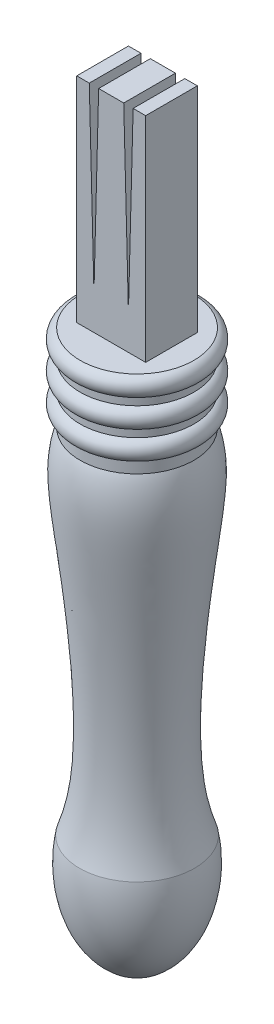
ISO-10303-21;
HEADER;
FILE_DESCRIPTION(('STEP AP214'),'2;1');
FILE_NAME('part.step','',(''),(''),'','','');
FILE_SCHEMA(('AUTOMOTIVE_DESIGN { 1 0 10303 214 1 1 1 1 }'));
ENDSEC;
DATA;
#1=APPLICATION_CONTEXT('core data for automotive mechanical design processes');
#2=APPLICATION_PROTOCOL_DEFINITION('international standard','automotive_design',2000,#1);
#3=PRODUCT_CONTEXT('',#1,'mechanical');
#4=PRODUCT('Part','Part','',(#3));
#5=PRODUCT_RELATED_PRODUCT_CATEGORY('part','',(#4));
#6=PRODUCT_DEFINITION_FORMATION('','',#4);
#7=PRODUCT_DEFINITION_CONTEXT('part definition',#1,'design');
#8=PRODUCT_DEFINITION('design','',#6,#7);
#9=PRODUCT_DEFINITION_SHAPE('','',#8);
#10=(LENGTH_UNIT() NAMED_UNIT(*) SI_UNIT(.MILLI.,.METRE.));
#11=(NAMED_UNIT(*) PLANE_ANGLE_UNIT() SI_UNIT($,.RADIAN.));
#12=(NAMED_UNIT(*) SI_UNIT($,.STERADIAN.) SOLID_ANGLE_UNIT());
#13=UNCERTAINTY_MEASURE_WITH_UNIT(LENGTH_MEASURE(1.E-05),#10,'distance_accuracy_value','');
#14=(GEOMETRIC_REPRESENTATION_CONTEXT(3) GLOBAL_UNCERTAINTY_ASSIGNED_CONTEXT((#13)) GLOBAL_UNIT_ASSIGNED_CONTEXT((#10,
#11,#12)) REPRESENTATION_CONTEXT('',''));
#15=CARTESIAN_POINT('',(0.,0.,0.));
#16=DIRECTION('',(0.,0.,1.));
#17=DIRECTION('',(1.,0.,0.));
#18=AXIS2_PLACEMENT_3D('',#15,#16,#17);
#19=CARTESIAN_POINT('',(0.,279.4,0.));
#20=DIRECTION('',(0.,1.,0.));
#21=DIRECTION('',(0.,0.,1.));
#22=AXIS2_PLACEMENT_3D('',#19,#20,#21);
#23=PLANE('',#22);
#24=DIRECTION('',(0.,0.,1.));
#25=VECTOR('',#24,1.);
#26=CARTESIAN_POINT('',(-8.07931826042913,279.4,0.));
#27=LINE('',#26,#25);
#28=CARTESIAN_POINT('',(-8.07931826042913,279.4,-9.525));
#29=VERTEX_POINT('',#28);
#30=CARTESIAN_POINT('',(-8.07931826042913,279.4,9.52500000000001));
#31=VERTEX_POINT('',#30);
#32=EDGE_CURVE('E12',#29,#31,#27,.T.);
#33=ORIENTED_EDGE('',*,*,#32,.F.);
#34=DIRECTION('',(-1.,0.,0.));
#35=VECTOR('',#34,1.);
#36=CARTESIAN_POINT('',(-12.7,279.4,-9.525));
#37=LINE('',#36,#35);
#38=CARTESIAN_POINT('',(-12.7,279.4,-9.525));
#39=VERTEX_POINT('',#38);
#40=EDGE_CURVE('E125',#29,#39,#37,.T.);
#41=ORIENTED_EDGE('',*,*,#40,.T.);
#42=DIRECTION('',(0.,0.,1.));
#43=VECTOR('',#42,1.);
#44=CARTESIAN_POINT('',(-12.7,279.4,9.525));
#45=LINE('',#44,#43);
#46=CARTESIAN_POINT('',(-12.7,279.4,9.525));
#47=VERTEX_POINT('',#46);
#48=EDGE_CURVE('E144',#39,#47,#45,.T.);
#49=ORIENTED_EDGE('',*,*,#48,.T.);
#50=DIRECTION('',(1.,0.,0.));
#51=VECTOR('',#50,1.);
#52=CARTESIAN_POINT('',(-12.7,279.4,9.525));
#53=LINE('',#52,#51);
#54=EDGE_CURVE('E128',#47,#31,#53,.T.);
#55=ORIENTED_EDGE('',*,*,#54,.T.);
#56=EDGE_LOOP('',(#33,#41,#49,#55));
#57=FACE_BOUND('',#56,.T.);
#58=ADVANCED_FACE('F34',(#57),#23,.T.);
#59=DIRECTION('',(0.,0.,-1.));
#60=VECTOR('',#59,1.);
#61=CARTESIAN_POINT('',(8.07931826042913,279.4,0.));
#62=LINE('',#61,#60);
#63=CARTESIAN_POINT('',(8.07931826042913,279.4,9.52500000000001));
#64=VERTEX_POINT('',#63);
#65=CARTESIAN_POINT('',(8.07931826042913,279.4,-9.525));
#66=VERTEX_POINT('',#65);
#67=EDGE_CURVE('E164',#64,#66,#62,.T.);
#68=ORIENTED_EDGE('',*,*,#67,.F.);
#69=CARTESIAN_POINT('',(12.7,279.4,9.525));
#70=VERTEX_POINT('',#69);
#71=EDGE_CURVE('E148',#64,#70,#53,.T.);
#72=ORIENTED_EDGE('',*,*,#71,.T.);
#73=DIRECTION('',(0.,0.,-1.));
#74=VECTOR('',#73,1.);
#75=CARTESIAN_POINT('',(12.7,279.4,9.525));
#76=LINE('',#75,#74);
#77=CARTESIAN_POINT('',(12.7,279.4,-9.525));
#78=VERTEX_POINT('',#77);
#79=EDGE_CURVE('E135',#70,#78,#76,.T.);
#80=ORIENTED_EDGE('',*,*,#79,.T.);
#81=EDGE_CURVE('E137',#78,#66,#37,.T.);
#82=ORIENTED_EDGE('',*,*,#81,.T.);
#83=EDGE_LOOP('',(#68,#72,#80,#82));
#84=FACE_BOUND('',#83,.T.);
#85=ADVANCED_FACE('F228',(#84),#23,.T.);
#86=CARTESIAN_POINT('',(0.,200.66,0.));
#87=DIRECTION('',(0.,1.,0.));
#88=DIRECTION('',(0.,0.,1.));
#89=AXIS2_PLACEMENT_3D('',#86,#87,#88);
#90=PLANE('',#89);
#91=CARTESIAN_POINT('',(0.,200.66,0.));
#92=DIRECTION('',(0.,-1.,0.));
#93=DIRECTION('',(0.,0.,-1.));
#94=AXIS2_PLACEMENT_3D('',#91,#92,#93);
#95=CIRCLE('',#94,20.9642383150594);
#96=CARTESIAN_POINT('',(0.,200.66,-20.9642383150594));
#97=VERTEX_POINT('',#96);
#98=EDGE_CURVE('E140',#97,#97,#95,.T.);
#99=ORIENTED_EDGE('',*,*,#98,.F.);
#100=EDGE_LOOP('',(#99));
#101=FACE_BOUND('',#100,.T.);
#102=DIRECTION('',(1.,0.,0.));
#103=VECTOR('',#102,1.);
#104=CARTESIAN_POINT('',(-12.7,200.66,9.525));
#105=LINE('',#104,#103);
#106=CARTESIAN_POINT('',(-12.7,200.66,9.525));
#107=VERTEX_POINT('',#106);
#108=CARTESIAN_POINT('',(12.7,200.66,9.525));
#109=VERTEX_POINT('',#108);
#110=EDGE_CURVE('E162',#107,#109,#105,.T.);
#111=ORIENTED_EDGE('',*,*,#110,.F.);
#112=DIRECTION('',(0.,0.,1.));
#113=VECTOR('',#112,1.);
#114=CARTESIAN_POINT('',(-12.7,200.66,9.525));
#115=LINE('',#114,#113);
#116=CARTESIAN_POINT('',(-12.7,200.66,-9.525));
#117=VERTEX_POINT('',#116);
#118=EDGE_CURVE('E254',#117,#107,#115,.T.);
#119=ORIENTED_EDGE('',*,*,#118,.F.);
#120=DIRECTION('',(-1.,0.,0.));
#121=VECTOR('',#120,1.);
#122=CARTESIAN_POINT('',(-12.7,200.66,-9.525));
#123=LINE('',#122,#121);
#124=CARTESIAN_POINT('',(12.7,200.66,-9.525));
#125=VERTEX_POINT('',#124);
#126=EDGE_CURVE('E256',#125,#117,#123,.T.);
#127=ORIENTED_EDGE('',*,*,#126,.F.);
#128=DIRECTION('',(0.,0.,-1.));
#129=VECTOR('',#128,1.);
#130=CARTESIAN_POINT('',(12.7,200.66,9.525));
#131=LINE('',#130,#129);
#132=EDGE_CURVE('E152',#109,#125,#131,.T.);
#133=ORIENTED_EDGE('',*,*,#132,.F.);
#134=EDGE_LOOP('',(#111,#119,#127,#133));
#135=FACE_BOUND('',#134,.T.);
#136=ADVANCED_FACE('F225',(#101,#135),#90,.T.);
#137=CARTESIAN_POINT('',(12.7,200.66,9.525));
#138=DIRECTION('',(1.,0.,0.));
#139=DIRECTION('',(0.,0.,-1.));
#140=AXIS2_PLACEMENT_3D('',#137,#138,#139);
#141=PLANE('',#140);
#142=ORIENTED_EDGE('',*,*,#79,.F.);
#143=DIRECTION('',(0.,1.,0.));
#144=VECTOR('',#143,1.);
#145=CARTESIAN_POINT('',(12.7,200.66,9.525));
#146=LINE('',#145,#144);
#147=EDGE_CURVE('E153',#109,#70,#146,.T.);
#148=ORIENTED_EDGE('',*,*,#147,.F.);
#149=ORIENTED_EDGE('',*,*,#132,.T.);
#150=DIRECTION('',(0.,1.,0.));
#151=VECTOR('',#150,1.);
#152=CARTESIAN_POINT('',(12.7,200.66,-9.525));
#153=LINE('',#152,#151);
#154=EDGE_CURVE('E160',#125,#78,#153,.T.);
#155=ORIENTED_EDGE('',*,*,#154,.T.);
#156=EDGE_LOOP('',(#142,#148,#149,#155));
#157=FACE_BOUND('',#156,.T.);
#158=ADVANCED_FACE('F217',(#157),#141,.T.);
#159=CARTESIAN_POINT('',(-12.7,200.66,9.525));
#160=DIRECTION('',(0.,0.,1.));
#161=DIRECTION('',(1.,0.,0.));
#162=AXIS2_PLACEMENT_3D('',#159,#160,#161);
#163=PLANE('',#162);
#164=DIRECTION('',(0.0261769483078734,-0.999657324975557,0.));
#165=VECTOR('',#164,1.);
#166=CARTESIAN_POINT('',(-6.02201790501154,200.83486911538,9.525));
#167=LINE('',#166,#165);
#168=CARTESIAN_POINT('',(-6.35000000000001,213.36,9.52500000000001));
#169=VERTEX_POINT('',#168);
#170=EDGE_CURVE('E247',#31,#169,#167,.T.);
#171=ORIENTED_EDGE('',*,*,#170,.F.);
#172=ORIENTED_EDGE('',*,*,#54,.F.);
#173=DIRECTION('',(0.,1.,0.));
#174=VECTOR('',#173,1.);
#175=CARTESIAN_POINT('',(-12.7,200.66,9.525));
#176=LINE('',#175,#174);
#177=EDGE_CURVE('E157',#107,#47,#176,.T.);
#178=ORIENTED_EDGE('',*,*,#177,.F.);
#179=ORIENTED_EDGE('',*,*,#110,.T.);
#180=ORIENTED_EDGE('',*,*,#147,.T.);
#181=ORIENTED_EDGE('',*,*,#71,.F.);
#182=DIRECTION('',(0.0261769483078737,0.999657324975557,0.));
#183=VECTOR('',#182,1.);
#184=CARTESIAN_POINT('',(6.00461299639461,200.170202471094,9.525));
#185=LINE('',#184,#183);
#186=CARTESIAN_POINT('',(6.35,213.36,9.52500000000001));
#187=VERTEX_POINT('',#186);
#188=EDGE_CURVE('E179',#187,#64,#185,.T.);
#189=ORIENTED_EDGE('',*,*,#188,.F.);
#190=DIRECTION('',(0.0261769483078734,-0.999657324975557,0.));
#191=VECTOR('',#190,1.);
#192=CARTESIAN_POINT('',(6.66927964068001,201.167202437522,9.525));
#193=LINE('',#192,#191);
#194=CARTESIAN_POINT('',(4.62068173957087,279.4,9.52500000000001));
#195=VERTEX_POINT('',#194);
#196=EDGE_CURVE('E173',#195,#187,#193,.T.);
#197=ORIENTED_EDGE('',*,*,#196,.F.);
#198=CARTESIAN_POINT('',(-4.62068173957087,279.4,9.525));
#199=VERTEX_POINT('',#198);
#200=EDGE_CURVE('E149',#199,#195,#53,.T.);
#201=ORIENTED_EDGE('',*,*,#200,.F.);
#202=DIRECTION('',(0.0261769483078737,0.999657324975557,0.));
#203=VECTOR('',#202,1.);
#204=CARTESIAN_POINT('',(-6.68668454929694,200.502535793237,9.525));
#205=LINE('',#204,#203);
#206=EDGE_CURVE('E49',#169,#199,#205,.T.);
#207=ORIENTED_EDGE('',*,*,#206,.F.);
#208=EDGE_LOOP('',(#171,#172,#178,#179,#180,#181,#189,#197,#201,#207));
#209=FACE_BOUND('',#208,.T.);
#210=ADVANCED_FACE('F177',(#209),#163,.T.);
#211=CARTESIAN_POINT('',(-12.7,200.66,9.525));
#212=DIRECTION('',(-1.,0.,0.));
#213=DIRECTION('',(0.,0.,1.));
#214=AXIS2_PLACEMENT_3D('',#211,#212,#213);
#215=PLANE('',#214);
#216=ORIENTED_EDGE('',*,*,#48,.F.);
#217=DIRECTION('',(0.,1.,0.));
#218=VECTOR('',#217,1.);
#219=CARTESIAN_POINT('',(-12.7,200.66,-9.525));
#220=LINE('',#219,#218);
#221=EDGE_CURVE('E133',#117,#39,#220,.T.);
#222=ORIENTED_EDGE('',*,*,#221,.F.);
#223=ORIENTED_EDGE('',*,*,#118,.T.);
#224=ORIENTED_EDGE('',*,*,#177,.T.);
#225=EDGE_LOOP('',(#216,#222,#223,#224));
#226=FACE_BOUND('',#225,.T.);
#227=ADVANCED_FACE('F216',(#226),#215,.T.);
#228=CARTESIAN_POINT('',(-12.7,200.66,-9.525));
#229=DIRECTION('',(0.,0.,-1.));
#230=DIRECTION('',(-1.,0.,0.));
#231=AXIS2_PLACEMENT_3D('',#228,#229,#230);
#232=PLANE('',#231);
#233=DIRECTION('',(-0.0261769483078734,0.999657324975557,0.));
#234=VECTOR('',#233,1.);
#235=CARTESIAN_POINT('',(-8.07931826042913,279.4,-9.525));
#236=LINE('',#235,#234);
#237=CARTESIAN_POINT('',(-6.35000000000001,213.36,-9.525));
#238=VERTEX_POINT('',#237);
#239=EDGE_CURVE('E111',#238,#29,#236,.T.);
#240=ORIENTED_EDGE('',*,*,#239,.F.);
#241=DIRECTION('',(-0.0261769483078737,-0.999657324975557,0.));
#242=VECTOR('',#241,1.);
#243=CARTESIAN_POINT('',(-4.62068173957087,279.4,-9.525));
#244=LINE('',#243,#242);
#245=CARTESIAN_POINT('',(-4.62068173957087,279.4,-9.525));
#246=VERTEX_POINT('',#245);
#247=EDGE_CURVE('E120',#246,#238,#244,.T.);
#248=ORIENTED_EDGE('',*,*,#247,.F.);
#249=CARTESIAN_POINT('',(4.62068173957087,279.4,-9.525));
#250=VERTEX_POINT('',#249);
#251=EDGE_CURVE('E134',#250,#246,#37,.T.);
#252=ORIENTED_EDGE('',*,*,#251,.F.);
#253=DIRECTION('',(-0.0261769483078734,0.999657324975557,0.));
#254=VECTOR('',#253,1.);
#255=CARTESIAN_POINT('',(4.62068173957087,279.4,-9.525));
#256=LINE('',#255,#254);
#257=CARTESIAN_POINT('',(6.35,213.36,-9.525));
#258=VERTEX_POINT('',#257);
#259=EDGE_CURVE('E57',#258,#250,#256,.T.);
#260=ORIENTED_EDGE('',*,*,#259,.F.);
#261=DIRECTION('',(-0.0261769483078737,-0.999657324975557,0.));
#262=VECTOR('',#261,1.);
#263=CARTESIAN_POINT('',(8.07931826042913,279.4,-9.525));
#264=LINE('',#263,#262);
#265=EDGE_CURVE('E246',#66,#258,#264,.T.);
#266=ORIENTED_EDGE('',*,*,#265,.F.);
#267=ORIENTED_EDGE('',*,*,#81,.F.);
#268=ORIENTED_EDGE('',*,*,#154,.F.);
#269=ORIENTED_EDGE('',*,*,#126,.T.);
#270=ORIENTED_EDGE('',*,*,#221,.T.);
#271=ORIENTED_EDGE('',*,*,#40,.F.);
#272=EDGE_LOOP('',(#240,#248,#252,#260,#266,#267,#268,#269,#270,#271));
#273=FACE_BOUND('',#272,.T.);
#274=ADVANCED_FACE('F130',(#273),#232,.T.);
#275=DIRECTION('',(0.,0.,-1.));
#276=VECTOR('',#275,1.);
#277=CARTESIAN_POINT('',(-4.62068173957087,279.4,0.));
#278=LINE('',#277,#276);
#279=EDGE_CURVE('E42',#199,#246,#278,.T.);
#280=ORIENTED_EDGE('',*,*,#279,.F.);
#281=ORIENTED_EDGE('',*,*,#200,.T.);
#282=DIRECTION('',(0.,0.,1.));
#283=VECTOR('',#282,1.);
#284=CARTESIAN_POINT('',(4.62068173957087,279.4,0.));
#285=LINE('',#284,#283);
#286=EDGE_CURVE('E156',#250,#195,#285,.T.);
#287=ORIENTED_EDGE('',*,*,#286,.F.);
#288=ORIENTED_EDGE('',*,*,#251,.T.);
#289=EDGE_LOOP('',(#280,#281,#287,#288));
#290=FACE_BOUND('',#289,.T.);
#291=ADVANCED_FACE('F170',(#290),#23,.T.);
#292=CARTESIAN_POINT('',(0.,197.016017868709,0.));
#293=DIRECTION('',(0.,-1.,0.));
#294=DIRECTION('',(0.,0.,-1.));
#295=AXIS2_PLACEMENT_3D('',#292,#293,#294);
#296=TOROIDAL_SURFACE('',#295,19.851811136843,3.81000000000002);
#297=CARTESIAN_POINT('',(0.,193.372035737419,0.));
#298=DIRECTION('',(0.,-1.,0.));
#299=DIRECTION('',(0.,0.,-1.));
#300=AXIS2_PLACEMENT_3D('',#297,#298,#299);
#301=CIRCLE('',#300,20.9642383150595);
#302=CARTESIAN_POINT('',(0.,193.372035737419,-20.9642383150595));
#303=VERTEX_POINT('',#302);
#304=EDGE_CURVE('E182',#303,#303,#301,.T.);
#305=ORIENTED_EDGE('',*,*,#304,.F.);
#306=EDGE_LOOP('',(#305));
#307=FACE_BOUND('',#306,.T.);
#308=ORIENTED_EDGE('',*,*,#98,.T.);
#309=EDGE_LOOP('',(#308));
#310=FACE_BOUND('',#309,.T.);
#311=ADVANCED_FACE('F209',(#307,#310),#296,.T.);
#312=CARTESIAN_POINT('',(-15.009340626362,38.7317846474829,15.009340626362));
#313=CARTESIAN_POINT('',(-16.853705569643,24.6214088100366,16.8537055696431));
#314=CARTESIAN_POINT('',(-14.0687461965341,8.07959408226824,14.0687461965341));
#315=CARTESIAN_POINT('',(-6.90742209424239,0.,6.9074220942424));
#316=B_SPLINE_CURVE_WITH_KNOTS('',3,(#312,#313,#314,#315),.UNSPECIFIED.,.F.,.F.,(4,4),(0.,1.),.UNSPECIFIED.);
#317=CARTESIAN_POINT('',(0.,0.,0.));
#318=DIRECTION('',(0.,-1.,0.));
#319=AXIS1_PLACEMENT('',#317,#318);
#320=SURFACE_OF_REVOLUTION('',#316,#319);
#321=CARTESIAN_POINT('',(0.,0.,0.));
#322=DIRECTION('',(0.,-1.,0.));
#323=DIRECTION('',(0.,0.,-1.));
#324=AXIS2_PLACEMENT_3D('',#321,#322,#323);
#325=CIRCLE('',#324,9.7685700067132);
#326=CARTESIAN_POINT('',(0.,0.,-9.76857000671323));
#327=VERTEX_POINT('',#326);
#328=EDGE_CURVE('E263',#327,#327,#325,.T.);
#329=ORIENTED_EDGE('',*,*,#328,.F.);
#330=EDGE_LOOP('',(#329));
#331=FACE_BOUND('',#330,.T.);
#332=CARTESIAN_POINT('',(0.,38.7317846474829,0.));
#333=DIRECTION('',(0.,-1.,0.));
#334=DIRECTION('',(0.,0.,-1.));
#335=AXIS2_PLACEMENT_3D('',#332,#333,#334);
#336=CIRCLE('',#335,21.2264130760787);
#337=CARTESIAN_POINT('',(0.,38.7317846474829,-21.2264130760787));
#338=VERTEX_POINT('',#337);
#339=EDGE_CURVE('E266',#338,#338,#336,.T.);
#340=ORIENTED_EDGE('',*,*,#339,.T.);
#341=EDGE_LOOP('',(#340));
#342=FACE_BOUND('',#341,.T.);
#343=ADVANCED_FACE('F204',(#331,#342),#320,.T.);
#344=CARTESIAN_POINT('',(-14.8239550749895,168.762129589025,14.8239550749895));
#345=CARTESIAN_POINT('',(-16.7952162942078,162.022226447131,16.7952162942078));
#346=CARTESIAN_POINT('',(-17.282630850401,151.529422692137,17.282630850401));
#347=CARTESIAN_POINT('',(-16.8764520535532,145.861776868271,16.8764520535532));
#348=CARTESIAN_POINT('',(-14.3128117932033,132.614344063261,14.3128117932033));
#349=CARTESIAN_POINT('',(-9.34967576591835,79.4050443666085,9.34967576591836));
#350=CARTESIAN_POINT('',(-10.2737026818944,57.8433163227347,10.2737026818944));
#351=CARTESIAN_POINT('',(-15.009340626362,38.7317846474829,15.009340626362));
#352=B_SPLINE_CURVE_WITH_KNOTS('',7,(#344,#345,#346,#347,#348,#349,#350,#351),.UNSPECIFIED.,.F.,
.F.,(8,8),(0.,1.),.UNSPECIFIED.);
#353=CARTESIAN_POINT('',(0.,0.,0.));
#354=DIRECTION('',(0.,-1.,0.));
#355=AXIS1_PLACEMENT('',#353,#354);
#356=SURFACE_OF_REVOLUTION('',#352,#355);
#357=ORIENTED_EDGE('',*,*,#339,.F.);
#358=EDGE_LOOP('',(#357));
#359=FACE_BOUND('',#358,.T.);
#360=CARTESIAN_POINT('',(0.,168.762129589025,0.));
#361=DIRECTION('',(0.,-1.,0.));
#362=DIRECTION('',(0.,0.,-1.));
#363=AXIS2_PLACEMENT_3D('',#360,#361,#362);
#364=CIRCLE('',#363,20.9642383150597);
#365=CARTESIAN_POINT('',(0.,168.762129589025,-20.9642383150597));
#366=VERTEX_POINT('',#365);
#367=EDGE_CURVE('E269',#366,#366,#364,.T.);
#368=ORIENTED_EDGE('',*,*,#367,.T.);
#369=EDGE_LOOP('',(#368));
#370=FACE_BOUND('',#369,.T.);
#371=ADVANCED_FACE('F199',(#359,#370),#356,.T.);
#372=CARTESIAN_POINT('',(0.,0.,0.));
#373=DIRECTION('',(0.,-1.,0.));
#374=DIRECTION('',(0.,0.,-1.));
#375=AXIS2_PLACEMENT_3D('',#372,#373,#374);
#376=CYLINDRICAL_SURFACE('',#375,20.9642383150597);
#377=ORIENTED_EDGE('',*,*,#367,.F.);
#378=EDGE_LOOP('',(#377));
#379=FACE_BOUND('',#378,.T.);
#380=CARTESIAN_POINT('',(0.,173.052035737419,0.));
#381=DIRECTION('',(0.,-1.,0.));
#382=DIRECTION('',(0.,0.,-1.));
#383=AXIS2_PLACEMENT_3D('',#380,#381,#382);
#384=CIRCLE('',#383,20.9642383150597);
#385=CARTESIAN_POINT('',(0.,173.052035737419,-20.9642383150597));
#386=VERTEX_POINT('',#385);
#387=EDGE_CURVE('E272',#386,#386,#384,.T.);
#388=ORIENTED_EDGE('',*,*,#387,.T.);
#389=EDGE_LOOP('',(#388));
#390=FACE_BOUND('',#389,.T.);
#391=ADVANCED_FACE('F203',(#379,#390),#376,.T.);
#392=CARTESIAN_POINT('',(0.,176.696017868709,0.));
#393=DIRECTION('',(0.,-1.,0.));
#394=DIRECTION('',(0.,0.,-1.));
#395=AXIS2_PLACEMENT_3D('',#392,#393,#394);
#396=TOROIDAL_SURFACE('',#395,19.8518111368432,3.81000000000002);
#397=ORIENTED_EDGE('',*,*,#387,.F.);
#398=EDGE_LOOP('',(#397));
#399=FACE_BOUND('',#398,.T.);
#400=CARTESIAN_POINT('',(0.,180.34,0.));
#401=DIRECTION('',(0.,-1.,0.));
#402=DIRECTION('',(0.,0.,-1.));
#403=AXIS2_PLACEMENT_3D('',#400,#401,#402);
#404=CIRCLE('',#403,20.9642383150597);
#405=CARTESIAN_POINT('',(0.,180.34,-20.9642383150597));
#406=VERTEX_POINT('',#405);
#407=EDGE_CURVE('E275',#406,#406,#404,.T.);
#408=ORIENTED_EDGE('',*,*,#407,.T.);
#409=EDGE_LOOP('',(#408));
#410=FACE_BOUND('',#409,.T.);
#411=ADVANCED_FACE('F307',(#399,#410),#396,.T.);
#412=CARTESIAN_POINT('',(0.,0.,0.));
#413=DIRECTION('',(0.,-1.,0.));
#414=DIRECTION('',(0.,0.,-1.));
#415=AXIS2_PLACEMENT_3D('',#412,#413,#414);
#416=CYLINDRICAL_SURFACE('',#415,20.9642383150596);
#417=ORIENTED_EDGE('',*,*,#407,.F.);
#418=EDGE_LOOP('',(#417));
#419=FACE_BOUND('',#418,.T.);
#420=CARTESIAN_POINT('',(0.,183.212035737419,0.));
#421=DIRECTION('',(0.,-1.,0.));
#422=DIRECTION('',(0.,0.,-1.));
#423=AXIS2_PLACEMENT_3D('',#420,#421,#422);
#424=CIRCLE('',#423,20.9642383150596);
#425=CARTESIAN_POINT('',(0.,183.212035737419,-20.9642383150596));
#426=VERTEX_POINT('',#425);
#427=EDGE_CURVE('E278',#426,#426,#424,.T.);
#428=ORIENTED_EDGE('',*,*,#427,.T.);
#429=EDGE_LOOP('',(#428));
#430=FACE_BOUND('',#429,.T.);
#431=ADVANCED_FACE('F299',(#419,#430),#416,.T.);
#432=CARTESIAN_POINT('',(0.,186.856017868709,0.));
#433=DIRECTION('',(0.,-1.,0.));
#434=DIRECTION('',(0.,0.,-1.));
#435=AXIS2_PLACEMENT_3D('',#432,#433,#434);
#436=TOROIDAL_SURFACE('',#435,19.8518111368431,3.81000000000002);
#437=ORIENTED_EDGE('',*,*,#427,.F.);
#438=EDGE_LOOP('',(#437));
#439=FACE_BOUND('',#438,.T.);
#440=CARTESIAN_POINT('',(0.,190.5,0.));
#441=DIRECTION('',(0.,-1.,0.));
#442=DIRECTION('',(0.,0.,-1.));
#443=AXIS2_PLACEMENT_3D('',#440,#441,#442);
#444=CIRCLE('',#443,20.9642383150596);
#445=CARTESIAN_POINT('',(0.,190.5,-20.9642383150596));
#446=VERTEX_POINT('',#445);
#447=EDGE_CURVE('E281',#446,#446,#444,.T.);
#448=ORIENTED_EDGE('',*,*,#447,.T.);
#449=EDGE_LOOP('',(#448));
#450=FACE_BOUND('',#449,.T.);
#451=ADVANCED_FACE('F290',(#439,#450),#436,.T.);
#452=CARTESIAN_POINT('',(0.,0.,0.));
#453=DIRECTION('',(0.,-1.,0.));
#454=DIRECTION('',(0.,0.,-1.));
#455=AXIS2_PLACEMENT_3D('',#452,#453,#454);
#456=CYLINDRICAL_SURFACE('',#455,20.9642383150595);
#457=ORIENTED_EDGE('',*,*,#447,.F.);
#458=EDGE_LOOP('',(#457));
#459=FACE_BOUND('',#458,.T.);
#460=ORIENTED_EDGE('',*,*,#304,.T.);
#461=EDGE_LOOP('',(#460));
#462=FACE_BOUND('',#461,.T.);
#463=ADVANCED_FACE('F286',(#459,#462),#456,.T.);
#464=CARTESIAN_POINT('',(0.,0.,0.));
#465=DIRECTION('',(0.,1.,0.));
#466=DIRECTION('',(0.,0.,1.));
#467=AXIS2_PLACEMENT_3D('',#464,#465,#466);
#468=PLANE('',#467);
#469=ORIENTED_EDGE('',*,*,#328,.T.);
#470=EDGE_LOOP('',(#469));
#471=FACE_BOUND('',#470,.T.);
#472=ADVANCED_FACE('F36',(#471),#468,.F.);
#473=CARTESIAN_POINT('',(8.07931826042913,279.4,69.215));
#474=DIRECTION('',(0.999657324975557,-0.0261769483078737,0.));
#475=DIRECTION('',(0.0261769483078737,0.999657324975557,0.));
#476=AXIS2_PLACEMENT_3D('',#473,#474,#475);
#477=PLANE('',#476);
#478=ORIENTED_EDGE('',*,*,#188,.T.);
#479=ORIENTED_EDGE('',*,*,#67,.T.);
#480=ORIENTED_EDGE('',*,*,#265,.T.);
#481=DIRECTION('',(0.,0.,-1.));
#482=VECTOR('',#481,1.);
#483=CARTESIAN_POINT('',(6.35,213.36,69.215));
#484=LINE('',#483,#482);
#485=EDGE_CURVE('E180',#187,#258,#484,.T.);
#486=ORIENTED_EDGE('',*,*,#485,.F.);
#487=EDGE_LOOP('',(#478,#479,#480,#486));
#488=FACE_BOUND('',#487,.T.);
#489=ADVANCED_FACE('F297',(#488),#477,.F.);
#490=CARTESIAN_POINT('',(4.62068173957087,279.4,69.215));
#491=DIRECTION('',(-0.999657324975557,-0.0261769483078734,0.));
#492=DIRECTION('',(0.0261769483078734,-0.999657324975557,0.));
#493=AXIS2_PLACEMENT_3D('',#490,#491,#492);
#494=PLANE('',#493);
#495=ORIENTED_EDGE('',*,*,#196,.T.);
#496=ORIENTED_EDGE('',*,*,#485,.T.);
#497=ORIENTED_EDGE('',*,*,#259,.T.);
#498=ORIENTED_EDGE('',*,*,#286,.T.);
#499=EDGE_LOOP('',(#495,#496,#497,#498));
#500=FACE_BOUND('',#499,.T.);
#501=ADVANCED_FACE('F172',(#500),#494,.F.);
#502=CARTESIAN_POINT('',(-8.07931826042913,279.4,69.215));
#503=DIRECTION('',(-0.999657324975557,-0.0261769483078734,0.));
#504=DIRECTION('',(0.0261769483078734,-0.999657324975557,0.));
#505=AXIS2_PLACEMENT_3D('',#502,#503,#504);
#506=PLANE('',#505);
#507=ORIENTED_EDGE('',*,*,#170,.T.);
#508=DIRECTION('',(0.,0.,-1.));
#509=VECTOR('',#508,1.);
#510=CARTESIAN_POINT('',(-6.35000000000001,213.36,69.215));
#511=LINE('',#510,#509);
#512=EDGE_CURVE('E115',#169,#238,#511,.T.);
#513=ORIENTED_EDGE('',*,*,#512,.T.);
#514=ORIENTED_EDGE('',*,*,#239,.T.);
#515=ORIENTED_EDGE('',*,*,#32,.T.);
#516=EDGE_LOOP('',(#507,#513,#514,#515));
#517=FACE_BOUND('',#516,.T.);
#518=ADVANCED_FACE('F113',(#517),#506,.F.);
#519=CARTESIAN_POINT('',(-4.62068173957087,279.4,69.215));
#520=DIRECTION('',(0.999657324975557,-0.0261769483078737,0.));
#521=DIRECTION('',(0.0261769483078737,0.999657324975557,0.));
#522=AXIS2_PLACEMENT_3D('',#519,#520,#521);
#523=PLANE('',#522);
#524=ORIENTED_EDGE('',*,*,#206,.T.);
#525=ORIENTED_EDGE('',*,*,#279,.T.);
#526=ORIENTED_EDGE('',*,*,#247,.T.);
#527=ORIENTED_EDGE('',*,*,#512,.F.);
#528=EDGE_LOOP('',(#524,#525,#526,#527));
#529=FACE_BOUND('',#528,.T.);
#530=ADVANCED_FACE('F165',(#529),#523,.F.);
#531=CLOSED_SHELL('',(#58,#85,#136,#158,#210,#227,#274,#291,#311,#343,#371,#391,#411,#431,#451,
#463,#472,#489,#501,#518,#530));
#532=MANIFOLD_SOLID_BREP('B2',#531);
#533=ADVANCED_BREP_SHAPE_REPRESENTATION('',(#18,#532),#14);
#534=SHAPE_DEFINITION_REPRESENTATION(#9,#533);
ENDSEC;
END-ISO-10303-21;
